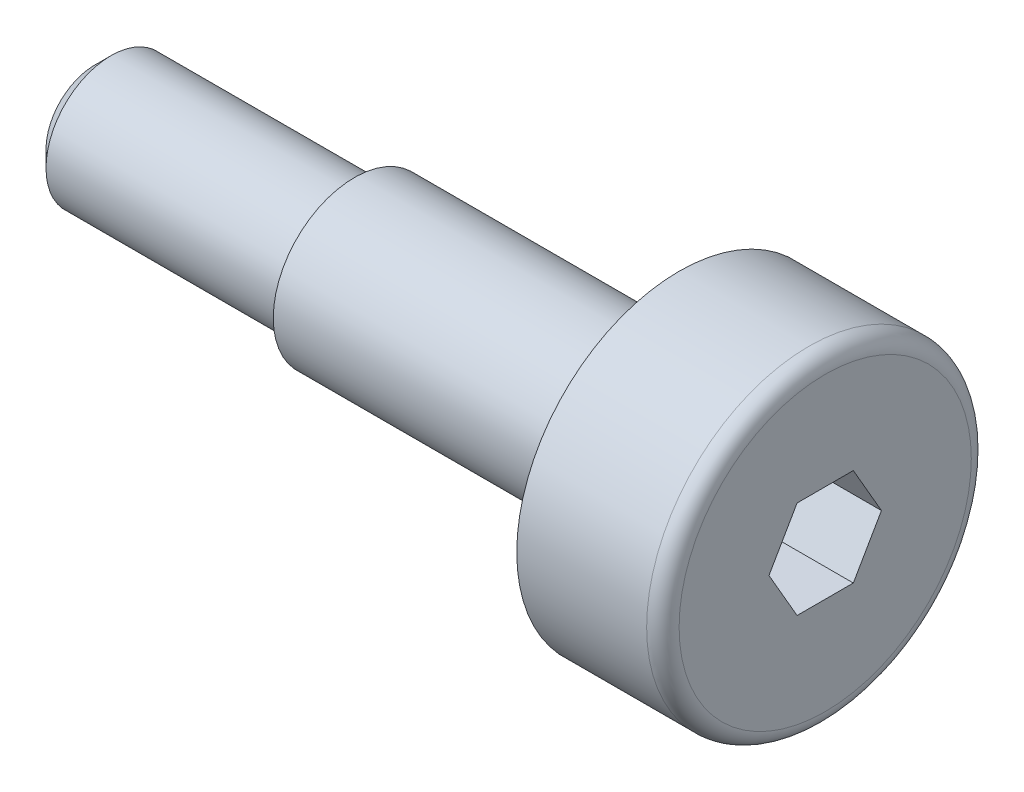
ISO-10303-21;
HEADER;
FILE_DESCRIPTION(('STEP AP214'),'2;1');
FILE_NAME('part.step','',(''),(''),'','','');
FILE_SCHEMA(('AUTOMOTIVE_DESIGN { 1 0 10303 214 1 1 1 1 }'));
ENDSEC;
DATA;
#1=APPLICATION_CONTEXT('core data for automotive mechanical design processes');
#2=APPLICATION_PROTOCOL_DEFINITION('international standard','automotive_design',2000,#1);
#3=PRODUCT_CONTEXT('',#1,'mechanical');
#4=PRODUCT('Part','Part','',(#3));
#5=PRODUCT_RELATED_PRODUCT_CATEGORY('part','',(#4));
#6=PRODUCT_DEFINITION_FORMATION('','',#4);
#7=PRODUCT_DEFINITION_CONTEXT('part definition',#1,'design');
#8=PRODUCT_DEFINITION('design','',#6,#7);
#9=PRODUCT_DEFINITION_SHAPE('','',#8);
#10=(LENGTH_UNIT() NAMED_UNIT(*) SI_UNIT(.MILLI.,.METRE.));
#11=(NAMED_UNIT(*) PLANE_ANGLE_UNIT() SI_UNIT($,.RADIAN.));
#12=(NAMED_UNIT(*) SI_UNIT($,.STERADIAN.) SOLID_ANGLE_UNIT());
#13=UNCERTAINTY_MEASURE_WITH_UNIT(LENGTH_MEASURE(1.E-05),#10,'distance_accuracy_value','');
#14=(GEOMETRIC_REPRESENTATION_CONTEXT(3) GLOBAL_UNCERTAINTY_ASSIGNED_CONTEXT((#13)) GLOBAL_UNIT_ASSIGNED_CONTEXT((#10,
#11,#12)) REPRESENTATION_CONTEXT('',''));
#15=CARTESIAN_POINT('',(0.,0.,0.));
#16=DIRECTION('',(0.,0.,1.));
#17=DIRECTION('',(1.,0.,0.));
#18=AXIS2_PLACEMENT_3D('',#15,#16,#17);
#19=CARTESIAN_POINT('',(0.,0.,0.));
#20=DIRECTION('',(-1.,0.,0.));
#21=DIRECTION('',(0.,0.,1.));
#22=AXIS2_PLACEMENT_3D('',#19,#20,#21);
#23=PLANE('',#22);
#24=DIRECTION('',(0.,0.866025403784439,0.5));
#25=VECTOR('',#24,1.);
#26=CARTESIAN_POINT('',(0.,0.,-1.73205080756888));
#27=LINE('',#26,#25);
#28=CARTESIAN_POINT('',(0.,0.,-1.73205080756888));
#29=VERTEX_POINT('',#28);
#30=CARTESIAN_POINT('',(0.,1.5,-0.866025403784438));
#31=VERTEX_POINT('',#30);
#32=EDGE_CURVE('E127',#29,#31,#27,.T.);
#33=ORIENTED_EDGE('',*,*,#32,.F.);
#34=DIRECTION('',(0.,0.866025403784439,-0.5));
#35=VECTOR('',#34,1.);
#36=CARTESIAN_POINT('',(0.,-1.5,-0.866025403784439));
#37=LINE('',#36,#35);
#38=CARTESIAN_POINT('',(0.,-1.5,-0.866025403784439));
#39=VERTEX_POINT('',#38);
#40=EDGE_CURVE('E53',#39,#29,#37,.T.);
#41=ORIENTED_EDGE('',*,*,#40,.F.);
#42=DIRECTION('',(0.,0.,-1.));
#43=VECTOR('',#42,1.);
#44=CARTESIAN_POINT('',(0.,-1.5,0.866025403784438));
#45=LINE('',#44,#43);
#46=CARTESIAN_POINT('',(0.,-1.5,0.866025403784438));
#47=VERTEX_POINT('',#46);
#48=EDGE_CURVE('E136',#47,#39,#45,.T.);
#49=ORIENTED_EDGE('',*,*,#48,.F.);
#50=DIRECTION('',(0.,-0.866025403784439,-0.5));
#51=VECTOR('',#50,1.);
#52=CARTESIAN_POINT('',(0.,0.,1.73205080756888));
#53=LINE('',#52,#51);
#54=CARTESIAN_POINT('',(0.,0.,1.73205080756888));
#55=VERTEX_POINT('',#54);
#56=EDGE_CURVE('E134',#55,#47,#53,.T.);
#57=ORIENTED_EDGE('',*,*,#56,.F.);
#58=DIRECTION('',(0.,-0.866025403784439,0.5));
#59=VECTOR('',#58,1.);
#60=CARTESIAN_POINT('',(0.,1.5,0.866025403784439));
#61=LINE('',#60,#59);
#62=CARTESIAN_POINT('',(0.,1.5,0.866025403784439));
#63=VERTEX_POINT('',#62);
#64=EDGE_CURVE('E101',#63,#55,#61,.T.);
#65=ORIENTED_EDGE('',*,*,#64,.F.);
#66=DIRECTION('',(0.,0.,1.));
#67=VECTOR('',#66,1.);
#68=CARTESIAN_POINT('',(0.,1.5,-0.866025403784438));
#69=LINE('',#68,#67);
#70=EDGE_CURVE('E130',#31,#63,#69,.T.);
#71=ORIENTED_EDGE('',*,*,#70,.F.);
#72=EDGE_LOOP('',(#33,#41,#49,#57,#65,#71));
#73=FACE_BOUND('',#72,.T.);
#74=CARTESIAN_POINT('',(0.,0.,0.));
#75=DIRECTION('',(-1.,0.,0.));
#76=DIRECTION('',(0.,0.,1.));
#77=AXIS2_PLACEMENT_3D('',#74,#75,#76);
#78=CIRCLE('',#77,4.5);
#79=CARTESIAN_POINT('',(0.,0.,4.5));
#80=VERTEX_POINT('',#79);
#81=EDGE_CURVE('E160',#80,#80,#78,.T.);
#82=ORIENTED_EDGE('',*,*,#81,.F.);
#83=EDGE_LOOP('',(#82));
#84=FACE_BOUND('',#83,.T.);
#85=ADVANCED_FACE('F38',(#73,#84),#23,.F.);
#86=CARTESIAN_POINT('',(-0.5,0.,0.));
#87=DIRECTION('',(-1.,0.,0.));
#88=DIRECTION('',(0.,0.,1.));
#89=AXIS2_PLACEMENT_3D('',#86,#87,#88);
#90=TOROIDAL_SURFACE('',#89,4.5,0.499999999999999);
#91=CARTESIAN_POINT('',(-0.5,0.,0.));
#92=DIRECTION('',(-1.,0.,0.));
#93=DIRECTION('',(0.,0.,1.));
#94=AXIS2_PLACEMENT_3D('',#91,#92,#93);
#95=CIRCLE('',#94,5.);
#96=CARTESIAN_POINT('',(-0.5,0.,5.));
#97=VERTEX_POINT('',#96);
#98=EDGE_CURVE('E157',#97,#97,#95,.T.);
#99=ORIENTED_EDGE('',*,*,#98,.F.);
#100=EDGE_LOOP('',(#99));
#101=FACE_BOUND('',#100,.T.);
#102=ORIENTED_EDGE('',*,*,#81,.T.);
#103=EDGE_LOOP('',(#102));
#104=FACE_BOUND('',#103,.T.);
#105=ADVANCED_FACE('F180',(#101,#104),#90,.T.);
#106=CARTESIAN_POINT('',(0.,0.,0.));
#107=DIRECTION('',(-1.,0.,0.));
#108=DIRECTION('',(0.,0.,1.));
#109=AXIS2_PLACEMENT_3D('',#106,#107,#108);
#110=CYLINDRICAL_SURFACE('',#109,5.);
#111=CARTESIAN_POINT('',(-4.5,0.,0.));
#112=DIRECTION('',(-1.,0.,0.));
#113=DIRECTION('',(0.,0.,1.));
#114=AXIS2_PLACEMENT_3D('',#111,#112,#113);
#115=CIRCLE('',#114,5.);
#116=CARTESIAN_POINT('',(-4.5,0.,5.));
#117=VERTEX_POINT('',#116);
#118=EDGE_CURVE('E154',#117,#117,#115,.T.);
#119=ORIENTED_EDGE('',*,*,#118,.F.);
#120=EDGE_LOOP('',(#119));
#121=FACE_BOUND('',#120,.T.);
#122=ORIENTED_EDGE('',*,*,#98,.T.);
#123=EDGE_LOOP('',(#122));
#124=FACE_BOUND('',#123,.T.);
#125=ADVANCED_FACE('F185',(#121,#124),#110,.T.);
#126=CARTESIAN_POINT('',(-4.5,5.,0.));
#127=DIRECTION('',(1.,0.,0.));
#128=DIRECTION('',(0.,0.,-1.));
#129=AXIS2_PLACEMENT_3D('',#126,#127,#128);
#130=PLANE('',#129);
#131=CARTESIAN_POINT('',(-4.5,0.,0.));
#132=DIRECTION('',(-1.,0.,0.));
#133=DIRECTION('',(0.,0.,1.));
#134=AXIS2_PLACEMENT_3D('',#131,#132,#133);
#135=CIRCLE('',#134,2.5);
#136=CARTESIAN_POINT('',(-4.5,0.,2.5));
#137=VERTEX_POINT('',#136);
#138=EDGE_CURVE('E151',#137,#137,#135,.T.);
#139=ORIENTED_EDGE('',*,*,#138,.F.);
#140=EDGE_LOOP('',(#139));
#141=FACE_BOUND('',#140,.T.);
#142=ORIENTED_EDGE('',*,*,#118,.T.);
#143=EDGE_LOOP('',(#142));
#144=FACE_BOUND('',#143,.T.);
#145=ADVANCED_FACE('F193',(#141,#144),#130,.F.);
#146=CARTESIAN_POINT('',(0.,0.,0.));
#147=DIRECTION('',(-1.,0.,0.));
#148=DIRECTION('',(0.,0.,1.));
#149=AXIS2_PLACEMENT_3D('',#146,#147,#148);
#150=CYLINDRICAL_SURFACE('',#149,2.5);
#151=CARTESIAN_POINT('',(-14.5,0.,0.));
#152=DIRECTION('',(-1.,0.,0.));
#153=DIRECTION('',(0.,0.,1.));
#154=AXIS2_PLACEMENT_3D('',#151,#152,#153);
#155=CIRCLE('',#154,2.5);
#156=CARTESIAN_POINT('',(-14.5,0.,2.5));
#157=VERTEX_POINT('',#156);
#158=EDGE_CURVE('E148',#157,#157,#155,.T.);
#159=ORIENTED_EDGE('',*,*,#158,.F.);
#160=EDGE_LOOP('',(#159));
#161=FACE_BOUND('',#160,.T.);
#162=ORIENTED_EDGE('',*,*,#138,.T.);
#163=EDGE_LOOP('',(#162));
#164=FACE_BOUND('',#163,.T.);
#165=ADVANCED_FACE('F197',(#161,#164),#150,.T.);
#166=CARTESIAN_POINT('',(-14.5,2.5,0.));
#167=DIRECTION('',(1.,0.,0.));
#168=DIRECTION('',(0.,0.,-1.));
#169=AXIS2_PLACEMENT_3D('',#166,#167,#168);
#170=PLANE('',#169);
#171=CARTESIAN_POINT('',(-14.5,0.,0.));
#172=DIRECTION('',(-1.,0.,0.));
#173=DIRECTION('',(0.,0.,1.));
#174=AXIS2_PLACEMENT_3D('',#171,#172,#173);
#175=CIRCLE('',#174,2.);
#176=CARTESIAN_POINT('',(-14.5,0.,2.));
#177=VERTEX_POINT('',#176);
#178=EDGE_CURVE('E140',#177,#177,#175,.T.);
#179=ORIENTED_EDGE('',*,*,#178,.F.);
#180=EDGE_LOOP('',(#179));
#181=FACE_BOUND('',#180,.T.);
#182=ORIENTED_EDGE('',*,*,#158,.T.);
#183=EDGE_LOOP('',(#182));
#184=FACE_BOUND('',#183,.T.);
#185=ADVANCED_FACE('F201',(#181,#184),#170,.F.);
#186=CARTESIAN_POINT('',(0.,0.,0.));
#187=DIRECTION('',(-1.,0.,0.));
#188=DIRECTION('',(0.,0.,1.));
#189=AXIS2_PLACEMENT_3D('',#186,#187,#188);
#190=CYLINDRICAL_SURFACE('',#189,2.);
#191=CARTESIAN_POINT('',(-22.,0.,0.));
#192=DIRECTION('',(1.,0.,0.));
#193=DIRECTION('',(0.,0.,-1.));
#194=AXIS2_PLACEMENT_3D('',#191,#192,#193);
#195=CIRCLE('',#194,2.);
#196=CARTESIAN_POINT('',(-22.,0.,-2.));
#197=VERTEX_POINT('',#196);
#198=EDGE_CURVE('E11',#197,#197,#195,.T.);
#199=ORIENTED_EDGE('',*,*,#198,.T.);
#200=EDGE_LOOP('',(#199));
#201=FACE_BOUND('',#200,.T.);
#202=ORIENTED_EDGE('',*,*,#178,.T.);
#203=EDGE_LOOP('',(#202));
#204=FACE_BOUND('',#203,.T.);
#205=ADVANCED_FACE('F176',(#201,#204),#190,.T.);
#206=CARTESIAN_POINT('',(-22.5,2.,0.));
#207=DIRECTION('',(1.,0.,0.));
#208=DIRECTION('',(0.,0.,-1.));
#209=AXIS2_PLACEMENT_3D('',#206,#207,#208);
#210=PLANE('',#209);
#211=CARTESIAN_POINT('',(-22.5,0.,0.));
#212=DIRECTION('',(1.,0.,0.));
#213=DIRECTION('',(0.,0.,-1.));
#214=AXIS2_PLACEMENT_3D('',#211,#212,#213);
#215=CIRCLE('',#214,1.5);
#216=CARTESIAN_POINT('',(-22.5,0.,-1.5));
#217=VERTEX_POINT('',#216);
#218=EDGE_CURVE('E46',#217,#217,#215,.F.);
#219=ORIENTED_EDGE('',*,*,#218,.T.);
#220=EDGE_LOOP('',(#219));
#221=FACE_BOUND('',#220,.T.);
#222=ADVANCED_FACE('F165',(#221),#210,.F.);
#223=CARTESIAN_POINT('',(-22.5,0.,0.));
#224=DIRECTION('',(1.,0.,0.));
#225=DIRECTION('',(0.,0.,-1.));
#226=AXIS2_PLACEMENT_3D('',#223,#224,#225);
#227=CONICAL_SURFACE('',#226,1.5,0.785398163397449);
#228=ORIENTED_EDGE('',*,*,#198,.F.);
#229=EDGE_LOOP('',(#228));
#230=FACE_BOUND('',#229,.T.);
#231=ORIENTED_EDGE('',*,*,#218,.F.);
#232=EDGE_LOOP('',(#231));
#233=FACE_BOUND('',#232,.T.);
#234=ADVANCED_FACE('F40',(#230,#233),#227,.T.);
#235=CARTESIAN_POINT('',(-2.4,-1.5,-0.866025403784439));
#236=DIRECTION('',(0.,-0.5,-0.866025403784439));
#237=DIRECTION('',(0.,0.866025403784439,-0.5));
#238=AXIS2_PLACEMENT_3D('',#235,#236,#237);
#239=PLANE('',#238);
#240=ORIENTED_EDGE('',*,*,#40,.T.);
#241=DIRECTION('',(1.,0.,0.));
#242=VECTOR('',#241,1.);
#243=CARTESIAN_POINT('',(-2.4,0.,-1.73205080756888));
#244=LINE('',#243,#242);
#245=CARTESIAN_POINT('',(-2.4,0.,-1.73205080756888));
#246=VERTEX_POINT('',#245);
#247=EDGE_CURVE('E83',#246,#29,#244,.T.);
#248=ORIENTED_EDGE('',*,*,#247,.F.);
#249=DIRECTION('',(0.,0.866025403784439,-0.5));
#250=VECTOR('',#249,1.);
#251=CARTESIAN_POINT('',(-2.4,-1.5,-0.866025403784439));
#252=LINE('',#251,#250);
#253=CARTESIAN_POINT('',(-2.4,-1.5,-0.866025403784439));
#254=VERTEX_POINT('',#253);
#255=EDGE_CURVE('E138',#254,#246,#252,.T.);
#256=ORIENTED_EDGE('',*,*,#255,.F.);
#257=DIRECTION('',(1.,0.,0.));
#258=VECTOR('',#257,1.);
#259=CARTESIAN_POINT('',(-2.4,-1.5,-0.866025403784439));
#260=LINE('',#259,#258);
#261=EDGE_CURVE('E61',#254,#39,#260,.T.);
#262=ORIENTED_EDGE('',*,*,#261,.T.);
#263=EDGE_LOOP('',(#240,#248,#256,#262));
#264=FACE_BOUND('',#263,.T.);
#265=ADVANCED_FACE('F168',(#264),#239,.F.);
#266=CARTESIAN_POINT('',(-2.4,-1.5,0.866025403784438));
#267=DIRECTION('',(0.,-1.,0.));
#268=DIRECTION('',(0.,0.,-1.));
#269=AXIS2_PLACEMENT_3D('',#266,#267,#268);
#270=PLANE('',#269);
#271=ORIENTED_EDGE('',*,*,#48,.T.);
#272=ORIENTED_EDGE('',*,*,#261,.F.);
#273=DIRECTION('',(0.,0.,-1.));
#274=VECTOR('',#273,1.);
#275=CARTESIAN_POINT('',(-2.4,-1.5,0.866025403784438));
#276=LINE('',#275,#274);
#277=CARTESIAN_POINT('',(-2.4,-1.5,0.866025403784438));
#278=VERTEX_POINT('',#277);
#279=EDGE_CURVE('E113',#278,#254,#276,.T.);
#280=ORIENTED_EDGE('',*,*,#279,.F.);
#281=DIRECTION('',(1.,0.,0.));
#282=VECTOR('',#281,1.);
#283=CARTESIAN_POINT('',(-2.4,-1.5,0.866025403784438));
#284=LINE('',#283,#282);
#285=EDGE_CURVE('E105',#278,#47,#284,.T.);
#286=ORIENTED_EDGE('',*,*,#285,.T.);
#287=EDGE_LOOP('',(#271,#272,#280,#286));
#288=FACE_BOUND('',#287,.T.);
#289=ADVANCED_FACE('F174',(#288),#270,.F.);
#290=CARTESIAN_POINT('',(-2.4,0.,1.73205080756888));
#291=DIRECTION('',(0.,-0.5,0.866025403784439));
#292=DIRECTION('',(0.,-0.866025403784439,-0.5));
#293=AXIS2_PLACEMENT_3D('',#290,#291,#292);
#294=PLANE('',#293);
#295=ORIENTED_EDGE('',*,*,#56,.T.);
#296=ORIENTED_EDGE('',*,*,#285,.F.);
#297=DIRECTION('',(0.,-0.866025403784439,-0.5));
#298=VECTOR('',#297,1.);
#299=CARTESIAN_POINT('',(-2.4,0.,1.73205080756888));
#300=LINE('',#299,#298);
#301=CARTESIAN_POINT('',(-2.4,0.,1.73205080756888));
#302=VERTEX_POINT('',#301);
#303=EDGE_CURVE('E109',#302,#278,#300,.T.);
#304=ORIENTED_EDGE('',*,*,#303,.F.);
#305=DIRECTION('',(1.,0.,0.));
#306=VECTOR('',#305,1.);
#307=CARTESIAN_POINT('',(-2.4,0.,1.73205080756888));
#308=LINE('',#307,#306);
#309=EDGE_CURVE('E94',#302,#55,#308,.T.);
#310=ORIENTED_EDGE('',*,*,#309,.T.);
#311=EDGE_LOOP('',(#295,#296,#304,#310));
#312=FACE_BOUND('',#311,.T.);
#313=ADVANCED_FACE('F110',(#312),#294,.F.);
#314=CARTESIAN_POINT('',(-2.4,1.5,0.866025403784439));
#315=DIRECTION('',(0.,0.5,0.866025403784439));
#316=DIRECTION('',(0.,-0.866025403784439,0.5));
#317=AXIS2_PLACEMENT_3D('',#314,#315,#316);
#318=PLANE('',#317);
#319=ORIENTED_EDGE('',*,*,#64,.T.);
#320=ORIENTED_EDGE('',*,*,#309,.F.);
#321=DIRECTION('',(0.,-0.866025403784439,0.5));
#322=VECTOR('',#321,1.);
#323=CARTESIAN_POINT('',(-2.4,1.5,0.866025403784439));
#324=LINE('',#323,#322);
#325=CARTESIAN_POINT('',(-2.4,1.5,0.866025403784439));
#326=VERTEX_POINT('',#325);
#327=EDGE_CURVE('E98',#326,#302,#324,.T.);
#328=ORIENTED_EDGE('',*,*,#327,.F.);
#329=DIRECTION('',(1.,0.,0.));
#330=VECTOR('',#329,1.);
#331=CARTESIAN_POINT('',(-2.4,1.5,0.866025403784439));
#332=LINE('',#331,#330);
#333=EDGE_CURVE('E106',#326,#63,#332,.T.);
#334=ORIENTED_EDGE('',*,*,#333,.T.);
#335=EDGE_LOOP('',(#319,#320,#328,#334));
#336=FACE_BOUND('',#335,.T.);
#337=ADVANCED_FACE('F96',(#336),#318,.F.);
#338=CARTESIAN_POINT('',(-2.4,1.5,-0.866025403784438));
#339=DIRECTION('',(0.,1.,0.));
#340=DIRECTION('',(0.,0.,1.));
#341=AXIS2_PLACEMENT_3D('',#338,#339,#340);
#342=PLANE('',#341);
#343=ORIENTED_EDGE('',*,*,#70,.T.);
#344=ORIENTED_EDGE('',*,*,#333,.F.);
#345=DIRECTION('',(0.,0.,1.));
#346=VECTOR('',#345,1.);
#347=CARTESIAN_POINT('',(-2.4,1.5,-0.866025403784438));
#348=LINE('',#347,#346);
#349=CARTESIAN_POINT('',(-2.4,1.5,-0.866025403784438));
#350=VERTEX_POINT('',#349);
#351=EDGE_CURVE('E119',#350,#326,#348,.T.);
#352=ORIENTED_EDGE('',*,*,#351,.F.);
#353=DIRECTION('',(1.,0.,0.));
#354=VECTOR('',#353,1.);
#355=CARTESIAN_POINT('',(-2.4,1.5,-0.866025403784438));
#356=LINE('',#355,#354);
#357=EDGE_CURVE('E143',#350,#31,#356,.T.);
#358=ORIENTED_EDGE('',*,*,#357,.T.);
#359=EDGE_LOOP('',(#343,#344,#352,#358));
#360=FACE_BOUND('',#359,.T.);
#361=ADVANCED_FACE('F212',(#360),#342,.F.);
#362=CARTESIAN_POINT('',(-2.4,0.,-1.73205080756888));
#363=DIRECTION('',(0.,0.5,-0.866025403784438));
#364=DIRECTION('',(0.,0.866025403784439,0.5));
#365=AXIS2_PLACEMENT_3D('',#362,#363,#364);
#366=PLANE('',#365);
#367=ORIENTED_EDGE('',*,*,#32,.T.);
#368=ORIENTED_EDGE('',*,*,#357,.F.);
#369=DIRECTION('',(0.,0.866025403784439,0.5));
#370=VECTOR('',#369,1.);
#371=CARTESIAN_POINT('',(-2.4,0.,-1.73205080756888));
#372=LINE('',#371,#370);
#373=EDGE_CURVE('E121',#246,#350,#372,.T.);
#374=ORIENTED_EDGE('',*,*,#373,.F.);
#375=ORIENTED_EDGE('',*,*,#247,.T.);
#376=EDGE_LOOP('',(#367,#368,#374,#375));
#377=FACE_BOUND('',#376,.T.);
#378=ADVANCED_FACE('F209',(#377),#366,.F.);
#379=CARTESIAN_POINT('',(-2.4,0.,0.));
#380=DIRECTION('',(1.,0.,0.));
#381=DIRECTION('',(0.,0.,-1.));
#382=AXIS2_PLACEMENT_3D('',#379,#380,#381);
#383=PLANE('',#382);
#384=ORIENTED_EDGE('',*,*,#255,.T.);
#385=ORIENTED_EDGE('',*,*,#373,.T.);
#386=ORIENTED_EDGE('',*,*,#351,.T.);
#387=ORIENTED_EDGE('',*,*,#327,.T.);
#388=ORIENTED_EDGE('',*,*,#303,.T.);
#389=ORIENTED_EDGE('',*,*,#279,.T.);
#390=EDGE_LOOP('',(#384,#385,#386,#387,#388,#389));
#391=FACE_BOUND('',#390,.T.);
#392=ADVANCED_FACE('F116',(#391),#383,.T.);
#393=CLOSED_SHELL('',(#85,#105,#125,#145,#165,#185,#205,#222,#234,#265,#289,#313,#337,#361,#378,#392));
#394=MANIFOLD_SOLID_BREP('B2',#393);
#395=ADVANCED_BREP_SHAPE_REPRESENTATION('',(#18,#394),#14);
#396=SHAPE_DEFINITION_REPRESENTATION(#9,#395);
ENDSEC;
END-ISO-10303-21;
